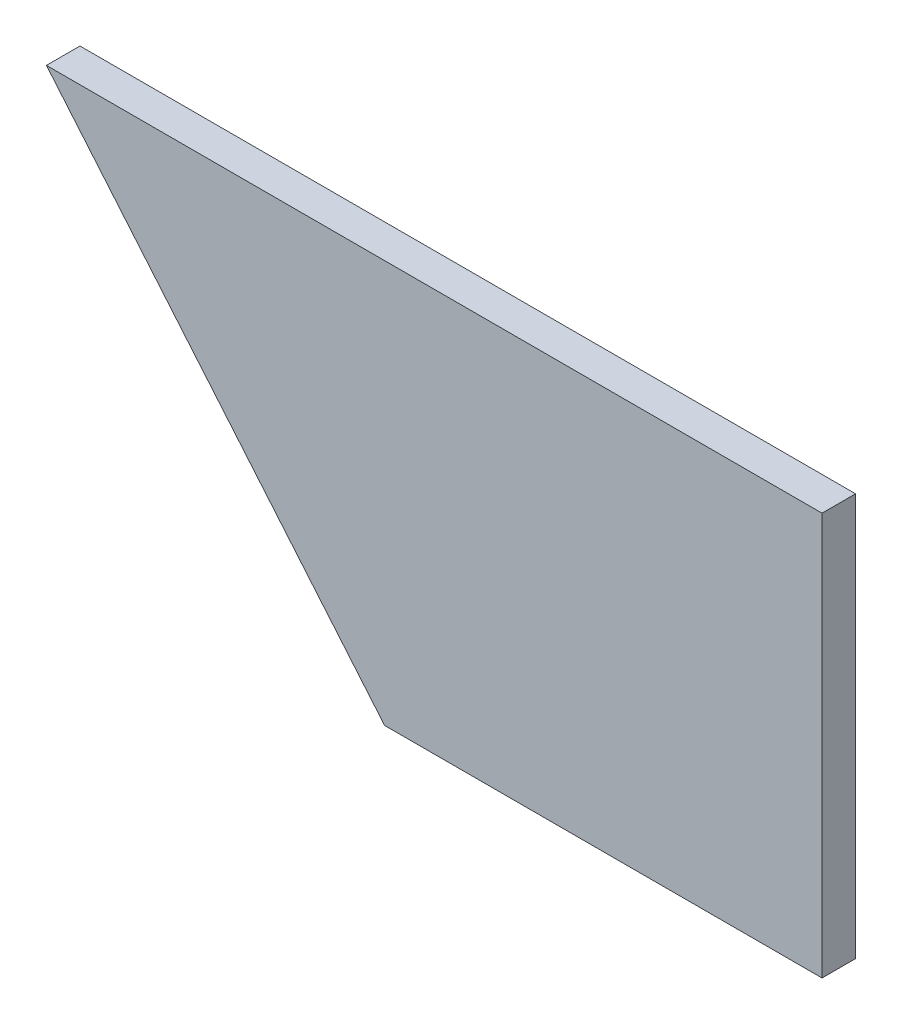
ISO-10303-21;
HEADER;
FILE_DESCRIPTION(('STEP AP214'),'2;1');
FILE_NAME('part.step','',(''),(''),'','','');
FILE_SCHEMA(('AUTOMOTIVE_DESIGN { 1 0 10303 214 1 1 1 1 }'));
ENDSEC;
DATA;
#1=APPLICATION_CONTEXT('core data for automotive mechanical design processes');
#2=APPLICATION_PROTOCOL_DEFINITION('international standard','automotive_design',2000,#1);
#3=PRODUCT_CONTEXT('',#1,'mechanical');
#4=PRODUCT('Part','Part','',(#3));
#5=PRODUCT_RELATED_PRODUCT_CATEGORY('part','',(#4));
#6=PRODUCT_DEFINITION_FORMATION('','',#4);
#7=PRODUCT_DEFINITION_CONTEXT('part definition',#1,'design');
#8=PRODUCT_DEFINITION('design','',#6,#7);
#9=PRODUCT_DEFINITION_SHAPE('','',#8);
#10=(LENGTH_UNIT() NAMED_UNIT(*) SI_UNIT(.MILLI.,.METRE.));
#11=(NAMED_UNIT(*) PLANE_ANGLE_UNIT() SI_UNIT($,.RADIAN.));
#12=(NAMED_UNIT(*) SI_UNIT($,.STERADIAN.) SOLID_ANGLE_UNIT());
#13=UNCERTAINTY_MEASURE_WITH_UNIT(LENGTH_MEASURE(1.E-05),#10,'distance_accuracy_value','');
#14=(GEOMETRIC_REPRESENTATION_CONTEXT(3) GLOBAL_UNCERTAINTY_ASSIGNED_CONTEXT((#13)) GLOBAL_UNIT_ASSIGNED_CONTEXT((#10,
#11,#12)) REPRESENTATION_CONTEXT('',''));
#15=CARTESIAN_POINT('',(0.,0.,0.));
#16=DIRECTION('',(0.,0.,1.));
#17=DIRECTION('',(1.,0.,0.));
#18=AXIS2_PLACEMENT_3D('',#15,#16,#17);
#19=CARTESIAN_POINT('',(0.,0.,0.));
#20=DIRECTION('',(0.,0.,-1.));
#21=DIRECTION('',(-1.,0.,0.));
#22=AXIS2_PLACEMENT_3D('',#19,#20,#21);
#23=PLANE('',#22);
#24=DIRECTION('',(0.,-1.,0.));
#25=VECTOR('',#24,1.);
#26=CARTESIAN_POINT('',(54.229,38.1,0.));
#27=LINE('',#26,#25);
#28=CARTESIAN_POINT('',(54.229,38.1,0.));
#29=VERTEX_POINT('',#28);
#30=CARTESIAN_POINT('',(54.229,0.,0.));
#31=VERTEX_POINT('',#30);
#32=EDGE_CURVE('E55',#29,#31,#27,.T.);
#33=ORIENTED_EDGE('',*,*,#32,.T.);
#34=DIRECTION('',(1.,0.,0.));
#35=VECTOR('',#34,1.);
#36=CARTESIAN_POINT('',(12.827,0.,0.));
#37=LINE('',#36,#35);
#38=CARTESIAN_POINT('',(12.827,0.,0.));
#39=VERTEX_POINT('',#38);
#40=EDGE_CURVE('E76',#31,#39,#37,.F.);
#41=ORIENTED_EDGE('',*,*,#40,.T.);
#42=DIRECTION('',(-0.643192086423273,0.765704864789611,0.));
#43=VECTOR('',#42,1.);
#44=CARTESIAN_POINT('',(12.827,0.,0.));
#45=LINE('',#44,#43);
#46=CARTESIAN_POINT('',(-19.177,38.1,0.));
#47=VERTEX_POINT('',#46);
#48=EDGE_CURVE('E58',#39,#47,#45,.T.);
#49=ORIENTED_EDGE('',*,*,#48,.T.);
#50=DIRECTION('',(1.,0.,0.));
#51=VECTOR('',#50,1.);
#52=CARTESIAN_POINT('',(-19.177,38.1,0.));
#53=LINE('',#52,#51);
#54=EDGE_CURVE('E20',#47,#29,#53,.T.);
#55=ORIENTED_EDGE('',*,*,#54,.T.);
#56=EDGE_LOOP('',(#33,#41,#49,#55));
#57=FACE_BOUND('',#56,.T.);
#58=ADVANCED_FACE('F17',(#57),#23,.T.);
#59=CARTESIAN_POINT('',(-19.177,38.1,3.175));
#60=DIRECTION('',(0.,-1.,0.));
#61=DIRECTION('',(1.,0.,0.));
#62=AXIS2_PLACEMENT_3D('',#59,#60,#61);
#63=PLANE('',#62);
#64=DIRECTION('',(0.,0.,1.));
#65=VECTOR('',#64,1.);
#66=CARTESIAN_POINT('',(-19.177,38.1,3.175));
#67=LINE('',#66,#65);
#68=CARTESIAN_POINT('',(-19.177,38.1,3.175));
#69=VERTEX_POINT('',#68);
#70=EDGE_CURVE('E78',#47,#69,#67,.T.);
#71=ORIENTED_EDGE('',*,*,#70,.T.);
#72=DIRECTION('',(-1.,0.,0.));
#73=VECTOR('',#72,1.);
#74=CARTESIAN_POINT('',(0.,38.1,3.175));
#75=LINE('',#74,#73);
#76=CARTESIAN_POINT('',(54.229,38.1,3.175));
#77=VERTEX_POINT('',#76);
#78=EDGE_CURVE('E73',#69,#77,#75,.F.);
#79=ORIENTED_EDGE('',*,*,#78,.T.);
#80=DIRECTION('',(0.,0.,1.));
#81=VECTOR('',#80,1.);
#82=CARTESIAN_POINT('',(54.229,38.1,3.175));
#83=LINE('',#82,#81);
#84=EDGE_CURVE('E63',#77,#29,#83,.F.);
#85=ORIENTED_EDGE('',*,*,#84,.T.);
#86=ORIENTED_EDGE('',*,*,#54,.F.);
#87=EDGE_LOOP('',(#71,#79,#85,#86));
#88=FACE_BOUND('',#87,.T.);
#89=ADVANCED_FACE('F72',(#88),#63,.F.);
#90=CARTESIAN_POINT('',(54.229,38.1,3.175));
#91=DIRECTION('',(-1.,0.,0.));
#92=DIRECTION('',(0.,-1.,0.));
#93=AXIS2_PLACEMENT_3D('',#90,#91,#92);
#94=PLANE('',#93);
#95=ORIENTED_EDGE('',*,*,#84,.F.);
#96=DIRECTION('',(0.,1.,0.));
#97=VECTOR('',#96,1.);
#98=CARTESIAN_POINT('',(54.229,0.,3.175));
#99=LINE('',#98,#97);
#100=CARTESIAN_POINT('',(54.229,0.,3.175));
#101=VERTEX_POINT('',#100);
#102=EDGE_CURVE('E83',#77,#101,#99,.F.);
#103=ORIENTED_EDGE('',*,*,#102,.T.);
#104=DIRECTION('',(0.,0.,1.));
#105=VECTOR('',#104,1.);
#106=CARTESIAN_POINT('',(54.229,0.,3.175));
#107=LINE('',#106,#105);
#108=EDGE_CURVE('E69',#101,#31,#107,.F.);
#109=ORIENTED_EDGE('',*,*,#108,.T.);
#110=ORIENTED_EDGE('',*,*,#32,.F.);
#111=EDGE_LOOP('',(#95,#103,#109,#110));
#112=FACE_BOUND('',#111,.T.);
#113=ADVANCED_FACE('F66',(#112),#94,.F.);
#114=CARTESIAN_POINT('',(12.827,0.,3.175));
#115=DIRECTION('',(0.,1.,0.));
#116=DIRECTION('',(0.,0.,1.));
#117=AXIS2_PLACEMENT_3D('',#114,#115,#116);
#118=PLANE('',#117);
#119=ORIENTED_EDGE('',*,*,#108,.F.);
#120=DIRECTION('',(-1.,0.,0.));
#121=VECTOR('',#120,1.);
#122=CARTESIAN_POINT('',(0.,0.,3.175));
#123=LINE('',#122,#121);
#124=CARTESIAN_POINT('',(12.827,0.,3.175));
#125=VERTEX_POINT('',#124);
#126=EDGE_CURVE('E26',#101,#125,#123,.T.);
#127=ORIENTED_EDGE('',*,*,#126,.T.);
#128=DIRECTION('',(0.,0.,1.));
#129=VECTOR('',#128,1.);
#130=CARTESIAN_POINT('',(12.827,0.,3.175));
#131=LINE('',#130,#129);
#132=EDGE_CURVE('E34',#125,#39,#131,.F.);
#133=ORIENTED_EDGE('',*,*,#132,.T.);
#134=ORIENTED_EDGE('',*,*,#40,.F.);
#135=EDGE_LOOP('',(#119,#127,#133,#134));
#136=FACE_BOUND('',#135,.T.);
#137=ADVANCED_FACE('F89',(#136),#118,.F.);
#138=CARTESIAN_POINT('',(12.827,0.,3.175));
#139=DIRECTION('',(0.765704864789611,0.643192086423273,0.));
#140=DIRECTION('',(-0.643192086423273,0.765704864789611,0.));
#141=AXIS2_PLACEMENT_3D('',#138,#139,#140);
#142=PLANE('',#141);
#143=ORIENTED_EDGE('',*,*,#132,.F.);
#144=DIRECTION('',(-0.643192086423273,0.765704864789611,0.));
#145=VECTOR('',#144,1.);
#146=CARTESIAN_POINT('',(12.827,0.,3.175));
#147=LINE('',#146,#145);
#148=EDGE_CURVE('E11',#125,#69,#147,.T.);
#149=ORIENTED_EDGE('',*,*,#148,.T.);
#150=ORIENTED_EDGE('',*,*,#70,.F.);
#151=ORIENTED_EDGE('',*,*,#48,.F.);
#152=EDGE_LOOP('',(#143,#149,#150,#151));
#153=FACE_BOUND('',#152,.T.);
#154=ADVANCED_FACE('F92',(#153),#142,.F.);
#155=CARTESIAN_POINT('',(0.,0.,3.175));
#156=DIRECTION('',(0.,0.,-1.));
#157=DIRECTION('',(-1.,0.,0.));
#158=AXIS2_PLACEMENT_3D('',#155,#156,#157);
#159=PLANE('',#158);
#160=ORIENTED_EDGE('',*,*,#126,.F.);
#161=ORIENTED_EDGE('',*,*,#102,.F.);
#162=ORIENTED_EDGE('',*,*,#78,.F.);
#163=ORIENTED_EDGE('',*,*,#148,.F.);
#164=EDGE_LOOP('',(#160,#161,#162,#163));
#165=FACE_BOUND('',#164,.T.);
#166=ADVANCED_FACE('F91',(#165),#159,.F.);
#167=CLOSED_SHELL('',(#58,#89,#113,#137,#154,#166));
#168=MANIFOLD_SOLID_BREP('B1',#167);
#169=ADVANCED_BREP_SHAPE_REPRESENTATION('',(#18,#168),#14);
#170=SHAPE_DEFINITION_REPRESENTATION(#9,#169);
ENDSEC;
END-ISO-10303-21;
